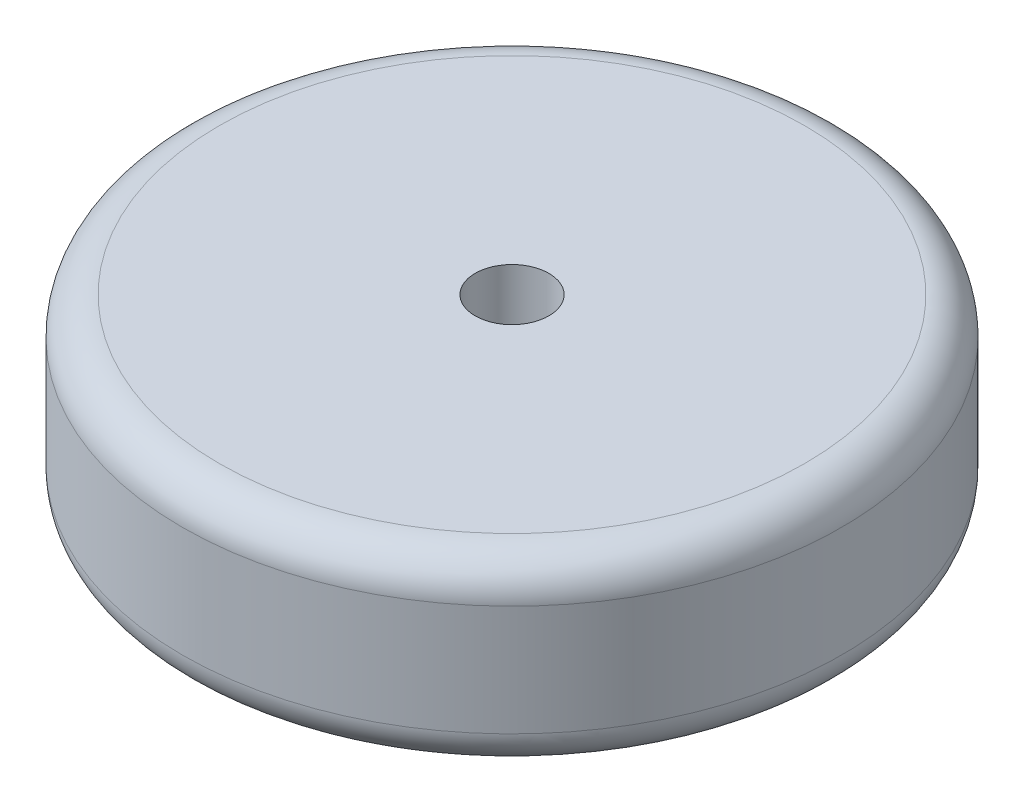
ISO-10303-21;
HEADER;
FILE_DESCRIPTION(('STEP AP214'),'2;1');
FILE_NAME('part.step','',(''),(''),'','','');
FILE_SCHEMA(('AUTOMOTIVE_DESIGN { 1 0 10303 214 1 1 1 1 }'));
ENDSEC;
DATA;
#1=APPLICATION_CONTEXT('core data for automotive mechanical design processes');
#2=APPLICATION_PROTOCOL_DEFINITION('international standard','automotive_design',2000,#1);
#3=PRODUCT_CONTEXT('',#1,'mechanical');
#4=PRODUCT('Part','Part','',(#3));
#5=PRODUCT_RELATED_PRODUCT_CATEGORY('part','',(#4));
#6=PRODUCT_DEFINITION_FORMATION('','',#4);
#7=PRODUCT_DEFINITION_CONTEXT('part definition',#1,'design');
#8=PRODUCT_DEFINITION('design','',#6,#7);
#9=PRODUCT_DEFINITION_SHAPE('','',#8);
#10=(LENGTH_UNIT() NAMED_UNIT(*) SI_UNIT(.MILLI.,.METRE.));
#11=(NAMED_UNIT(*) PLANE_ANGLE_UNIT() SI_UNIT($,.RADIAN.));
#12=(NAMED_UNIT(*) SI_UNIT($,.STERADIAN.) SOLID_ANGLE_UNIT());
#13=UNCERTAINTY_MEASURE_WITH_UNIT(LENGTH_MEASURE(1.E-05),#10,'distance_accuracy_value','');
#14=(GEOMETRIC_REPRESENTATION_CONTEXT(3) GLOBAL_UNCERTAINTY_ASSIGNED_CONTEXT((#13)) GLOBAL_UNIT_ASSIGNED_CONTEXT((#10,
#11,#12)) REPRESENTATION_CONTEXT('',''));
#15=CARTESIAN_POINT('',(0.,0.,0.));
#16=DIRECTION('',(0.,0.,1.));
#17=DIRECTION('',(1.,0.,0.));
#18=AXIS2_PLACEMENT_3D('',#15,#16,#17);
#19=CARTESIAN_POINT('',(0.,5.,0.));
#20=DIRECTION('',(0.,-1.,0.));
#21=DIRECTION('',(0.,0.,-1.));
#22=AXIS2_PLACEMENT_3D('',#19,#20,#21);
#23=CYLINDRICAL_SURFACE('',#22,8.94);
#24=CARTESIAN_POINT('',(0.,1.,0.));
#25=DIRECTION('',(0.,1.,0.));
#26=DIRECTION('',(0.,0.,1.));
#27=AXIS2_PLACEMENT_3D('',#24,#25,#26);
#28=CIRCLE('',#27,8.94);
#29=CARTESIAN_POINT('',(0.,1.,8.94));
#30=VERTEX_POINT('',#29);
#31=EDGE_CURVE('E56',#30,#30,#28,.T.);
#32=ORIENTED_EDGE('',*,*,#31,.T.);
#33=EDGE_LOOP('',(#32));
#34=FACE_BOUND('',#33,.T.);
#35=CARTESIAN_POINT('',(0.,4.,0.));
#36=DIRECTION('',(0.,1.,0.));
#37=DIRECTION('',(0.,0.,1.));
#38=AXIS2_PLACEMENT_3D('',#35,#36,#37);
#39=CIRCLE('',#38,8.94);
#40=CARTESIAN_POINT('',(0.,4.,8.94));
#41=VERTEX_POINT('',#40);
#42=EDGE_CURVE('E60',#41,#41,#39,.F.);
#43=ORIENTED_EDGE('',*,*,#42,.T.);
#44=EDGE_LOOP('',(#43));
#45=FACE_BOUND('',#44,.T.);
#46=ADVANCED_FACE('F45',(#34,#45),#23,.T.);
#47=CARTESIAN_POINT('',(0.,5.,0.));
#48=DIRECTION('',(0.,1.,0.));
#49=DIRECTION('',(0.,0.,1.));
#50=AXIS2_PLACEMENT_3D('',#47,#48,#49);
#51=PLANE('',#50);
#52=CARTESIAN_POINT('',(0.,5.,0.));
#53=DIRECTION('',(0.,1.,0.));
#54=DIRECTION('',(0.,0.,1.));
#55=AXIS2_PLACEMENT_3D('',#52,#53,#54);
#56=CIRCLE('',#55,1.);
#57=CARTESIAN_POINT('',(0.,5.,1.));
#58=VERTEX_POINT('',#57);
#59=EDGE_CURVE('E68',#58,#58,#56,.T.);
#60=ORIENTED_EDGE('',*,*,#59,.F.);
#61=EDGE_LOOP('',(#60));
#62=FACE_BOUND('',#61,.T.);
#63=CARTESIAN_POINT('',(0.,5.,0.));
#64=DIRECTION('',(0.,1.,0.));
#65=DIRECTION('',(0.,0.,1.));
#66=AXIS2_PLACEMENT_3D('',#63,#64,#65);
#67=CIRCLE('',#66,7.94);
#68=CARTESIAN_POINT('',(0.,5.,7.94));
#69=VERTEX_POINT('',#68);
#70=EDGE_CURVE('E10',#69,#69,#67,.T.);
#71=ORIENTED_EDGE('',*,*,#70,.T.);
#72=EDGE_LOOP('',(#71));
#73=FACE_BOUND('',#72,.T.);
#74=ADVANCED_FACE('F75',(#62,#73),#51,.T.);
#75=CARTESIAN_POINT('',(0.,0.,0.));
#76=DIRECTION('',(0.,1.,0.));
#77=DIRECTION('',(0.,0.,1.));
#78=AXIS2_PLACEMENT_3D('',#75,#76,#77);
#79=PLANE('',#78);
#80=CARTESIAN_POINT('',(0.,0.,0.));
#81=DIRECTION('',(0.,1.,0.));
#82=DIRECTION('',(0.,0.,1.));
#83=AXIS2_PLACEMENT_3D('',#80,#81,#82);
#84=CIRCLE('',#83,1.);
#85=CARTESIAN_POINT('',(0.,0.,1.));
#86=VERTEX_POINT('',#85);
#87=EDGE_CURVE('E65',#86,#86,#84,.F.);
#88=ORIENTED_EDGE('',*,*,#87,.F.);
#89=EDGE_LOOP('',(#88));
#90=FACE_BOUND('',#89,.T.);
#91=CARTESIAN_POINT('',(0.,0.,0.));
#92=DIRECTION('',(0.,1.,0.));
#93=DIRECTION('',(0.,0.,1.));
#94=AXIS2_PLACEMENT_3D('',#91,#92,#93);
#95=CIRCLE('',#94,7.94);
#96=CARTESIAN_POINT('',(0.,0.,7.94));
#97=VERTEX_POINT('',#96);
#98=EDGE_CURVE('E52',#97,#97,#95,.F.);
#99=ORIENTED_EDGE('',*,*,#98,.T.);
#100=EDGE_LOOP('',(#99));
#101=FACE_BOUND('',#100,.T.);
#102=ADVANCED_FACE('F77',(#90,#101),#79,.F.);
#103=CARTESIAN_POINT('',(0.,1.,0.));
#104=DIRECTION('',(0.,1.,0.));
#105=DIRECTION('',(0.,0.,1.));
#106=AXIS2_PLACEMENT_3D('',#103,#104,#105);
#107=TOROIDAL_SURFACE('',#106,7.94,1.);
#108=ORIENTED_EDGE('',*,*,#98,.F.);
#109=EDGE_LOOP('',(#108));
#110=FACE_BOUND('',#109,.T.);
#111=ORIENTED_EDGE('',*,*,#31,.F.);
#112=EDGE_LOOP('',(#111));
#113=FACE_BOUND('',#112,.T.);
#114=ADVANCED_FACE('F82',(#110,#113),#107,.T.);
#115=CARTESIAN_POINT('',(0.,4.,0.));
#116=DIRECTION('',(0.,1.,0.));
#117=DIRECTION('',(0.,0.,1.));
#118=AXIS2_PLACEMENT_3D('',#115,#116,#117);
#119=TOROIDAL_SURFACE('',#118,7.94,1.);
#120=ORIENTED_EDGE('',*,*,#42,.F.);
#121=EDGE_LOOP('',(#120));
#122=FACE_BOUND('',#121,.T.);
#123=ORIENTED_EDGE('',*,*,#70,.F.);
#124=EDGE_LOOP('',(#123));
#125=FACE_BOUND('',#124,.T.);
#126=ADVANCED_FACE('F47',(#122,#125),#119,.T.);
#127=CARTESIAN_POINT('',(0.,-0.00100000000000013,0.));
#128=DIRECTION('',(0.,1.,0.));
#129=DIRECTION('',(0.,0.,1.));
#130=AXIS2_PLACEMENT_3D('',#127,#128,#129);
#131=CYLINDRICAL_SURFACE('',#130,1.);
#132=ORIENTED_EDGE('',*,*,#59,.T.);
#133=EDGE_LOOP('',(#132));
#134=FACE_BOUND('',#133,.T.);
#135=ORIENTED_EDGE('',*,*,#87,.T.);
#136=EDGE_LOOP('',(#135));
#137=FACE_BOUND('',#136,.T.);
#138=ADVANCED_FACE('F72',(#134,#137),#131,.F.);
#139=CLOSED_SHELL('',(#46,#74,#102,#114,#126,#138));
#140=MANIFOLD_SOLID_BREP('B2',#139);
#141=ADVANCED_BREP_SHAPE_REPRESENTATION('',(#18,#140),#14);
#142=SHAPE_DEFINITION_REPRESENTATION(#9,#141);
ENDSEC;
END-ISO-10303-21;
